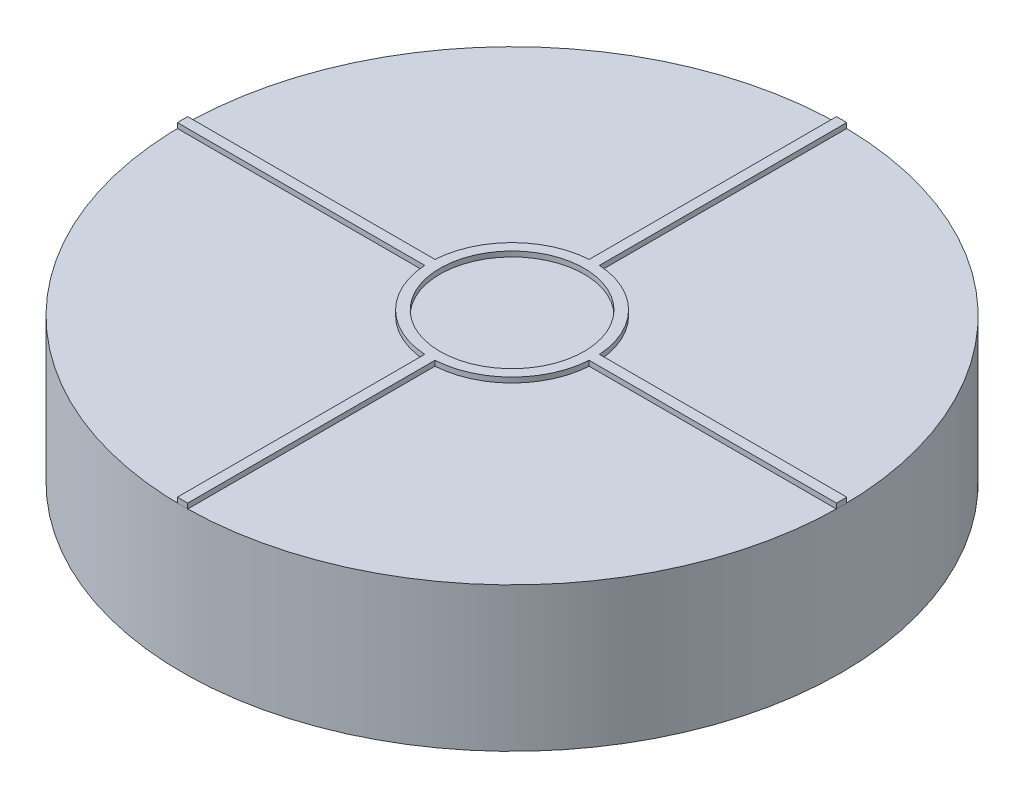
ISO-10303-21;
HEADER;
FILE_DESCRIPTION(('STEP AP214'),'2;1');
FILE_NAME('part.step','',(''),(''),'','','');
FILE_SCHEMA(('AUTOMOTIVE_DESIGN { 1 0 10303 214 1 1 1 1 }'));
ENDSEC;
DATA;
#1=APPLICATION_CONTEXT('core data for automotive mechanical design processes');
#2=APPLICATION_PROTOCOL_DEFINITION('international standard','automotive_design',2000,#1);
#3=PRODUCT_CONTEXT('',#1,'mechanical');
#4=PRODUCT('Part','Part','',(#3));
#5=PRODUCT_RELATED_PRODUCT_CATEGORY('part','',(#4));
#6=PRODUCT_DEFINITION_FORMATION('','',#4);
#7=PRODUCT_DEFINITION_CONTEXT('part definition',#1,'design');
#8=PRODUCT_DEFINITION('design','',#6,#7);
#9=PRODUCT_DEFINITION_SHAPE('','',#8);
#10=(LENGTH_UNIT() NAMED_UNIT(*) SI_UNIT(.MILLI.,.METRE.));
#11=(NAMED_UNIT(*) PLANE_ANGLE_UNIT() SI_UNIT($,.RADIAN.));
#12=(NAMED_UNIT(*) SI_UNIT($,.STERADIAN.) SOLID_ANGLE_UNIT());
#13=UNCERTAINTY_MEASURE_WITH_UNIT(LENGTH_MEASURE(1.E-05),#10,'distance_accuracy_value','');
#14=(GEOMETRIC_REPRESENTATION_CONTEXT(3) GLOBAL_UNCERTAINTY_ASSIGNED_CONTEXT((#13)) GLOBAL_UNIT_ASSIGNED_CONTEXT((#10,
#11,#12)) REPRESENTATION_CONTEXT('',''));
#15=CARTESIAN_POINT('',(0.,0.,0.));
#16=DIRECTION('',(0.,0.,1.));
#17=DIRECTION('',(1.,0.,0.));
#18=AXIS2_PLACEMENT_3D('',#15,#16,#17);
#19=CARTESIAN_POINT('',(0.,7.25,0.));
#20=DIRECTION('',(0.,-1.,0.));
#21=DIRECTION('',(1.,0.,0.));
#22=AXIS2_PLACEMENT_3D('',#19,#20,#21);
#23=CYLINDRICAL_SURFACE('',#22,4.);
#24=CARTESIAN_POINT('',(0.,7.,0.));
#25=DIRECTION('',(0.,1.,0.));
#26=DIRECTION('',(0.,0.,1.));
#27=AXIS2_PLACEMENT_3D('',#24,#25,#26);
#28=CIRCLE('',#27,4.);
#29=CARTESIAN_POINT('',(0.25,7.,3.99217985566783));
#30=VERTEX_POINT('',#29);
#31=CARTESIAN_POINT('',(3.99217985566783,7.,0.25));
#32=VERTEX_POINT('',#31);
#33=EDGE_CURVE('E199',#30,#32,#28,.T.);
#34=ORIENTED_EDGE('',*,*,#33,.T.);
#35=DIRECTION('',(0.,-1.,0.));
#36=VECTOR('',#35,1.);
#37=CARTESIAN_POINT('',(3.99217985566783,7.25,0.25));
#38=LINE('',#37,#36);
#39=CARTESIAN_POINT('',(3.99217985566783,7.25,0.25));
#40=VERTEX_POINT('',#39);
#41=EDGE_CURVE('E12',#40,#32,#38,.T.);
#42=ORIENTED_EDGE('',*,*,#41,.F.);
#43=CARTESIAN_POINT('',(0.,7.25,0.));
#44=DIRECTION('',(0.,1.,0.));
#45=DIRECTION('',(0.,0.,1.));
#46=AXIS2_PLACEMENT_3D('',#43,#44,#45);
#47=CIRCLE('',#46,4.);
#48=CARTESIAN_POINT('',(0.25,7.25,3.99217985566783));
#49=VERTEX_POINT('',#48);
#50=EDGE_CURVE('E190',#49,#40,#47,.T.);
#51=ORIENTED_EDGE('',*,*,#50,.F.);
#52=DIRECTION('',(0.,-1.,0.));
#53=VECTOR('',#52,1.);
#54=CARTESIAN_POINT('',(0.25,7.25,3.99217985566783));
#55=LINE('',#54,#53);
#56=EDGE_CURVE('E195',#49,#30,#55,.T.);
#57=ORIENTED_EDGE('',*,*,#56,.T.);
#58=EDGE_LOOP('',(#34,#42,#51,#57));
#59=FACE_BOUND('',#58,.T.);
#60=ADVANCED_FACE('F47',(#59),#23,.T.);
#61=CARTESIAN_POINT('',(0.,7.25,0.25));
#62=DIRECTION('',(0.,0.,-1.));
#63=DIRECTION('',(-1.,0.,0.));
#64=AXIS2_PLACEMENT_3D('',#61,#62,#63);
#65=PLANE('',#64);
#66=DIRECTION('',(1.,0.,0.));
#67=VECTOR('',#66,1.);
#68=CARTESIAN_POINT('',(0.,7.,0.25));
#69=LINE('',#68,#67);
#70=CARTESIAN_POINT('',(15.9980467557762,7.,0.25));
#71=VERTEX_POINT('',#70);
#72=EDGE_CURVE('E202',#32,#71,#69,.T.);
#73=ORIENTED_EDGE('',*,*,#72,.T.);
#74=DIRECTION('',(0.,-1.,0.));
#75=VECTOR('',#74,1.);
#76=CARTESIAN_POINT('',(15.9980467557762,7.25,0.25));
#77=LINE('',#76,#75);
#78=CARTESIAN_POINT('',(15.9980467557762,7.25,0.25));
#79=VERTEX_POINT('',#78);
#80=EDGE_CURVE('E56',#79,#71,#77,.T.);
#81=ORIENTED_EDGE('',*,*,#80,.F.);
#82=DIRECTION('',(1.,0.,0.));
#83=VECTOR('',#82,1.);
#84=CARTESIAN_POINT('',(0.,7.25,0.25));
#85=LINE('',#84,#83);
#86=EDGE_CURVE('E130',#40,#79,#85,.T.);
#87=ORIENTED_EDGE('',*,*,#86,.F.);
#88=ORIENTED_EDGE('',*,*,#41,.T.);
#89=EDGE_LOOP('',(#73,#81,#87,#88));
#90=FACE_BOUND('',#89,.T.);
#91=ADVANCED_FACE('F320',(#90),#65,.F.);
#92=CARTESIAN_POINT('',(0.,7.25,0.));
#93=DIRECTION('',(0.,-1.,0.));
#94=DIRECTION('',(1.,0.,0.));
#95=AXIS2_PLACEMENT_3D('',#92,#93,#94);
#96=CYLINDRICAL_SURFACE('',#95,16.);
#97=CARTESIAN_POINT('',(0.,7.,0.));
#98=DIRECTION('',(0.,1.,0.));
#99=DIRECTION('',(0.,0.,1.));
#100=AXIS2_PLACEMENT_3D('',#97,#98,#99);
#101=CIRCLE('',#100,16.);
#102=CARTESIAN_POINT('',(15.9980467557762,7.,-0.25));
#103=VERTEX_POINT('',#102);
#104=EDGE_CURVE('E206',#71,#103,#101,.T.);
#105=ORIENTED_EDGE('',*,*,#104,.T.);
#106=DIRECTION('',(0.,-1.,0.));
#107=VECTOR('',#106,1.);
#108=CARTESIAN_POINT('',(15.9980467557762,7.25,-0.25));
#109=LINE('',#108,#107);
#110=CARTESIAN_POINT('',(15.9980467557762,7.25,-0.25));
#111=VERTEX_POINT('',#110);
#112=EDGE_CURVE('E257',#111,#103,#109,.T.);
#113=ORIENTED_EDGE('',*,*,#112,.F.);
#114=CARTESIAN_POINT('',(0.,7.25,0.));
#115=DIRECTION('',(0.,1.,0.));
#116=DIRECTION('',(0.,0.,1.));
#117=AXIS2_PLACEMENT_3D('',#114,#115,#116);
#118=CIRCLE('',#117,16.);
#119=EDGE_CURVE('E264',#79,#111,#118,.T.);
#120=ORIENTED_EDGE('',*,*,#119,.F.);
#121=ORIENTED_EDGE('',*,*,#80,.T.);
#122=EDGE_LOOP('',(#105,#113,#120,#121));
#123=FACE_BOUND('',#122,.T.);
#124=ADVANCED_FACE('F262',(#123),#96,.T.);
#125=CARTESIAN_POINT('',(0.,7.25,-0.25));
#126=DIRECTION('',(0.,0.,-1.));
#127=DIRECTION('',(-1.,0.,0.));
#128=AXIS2_PLACEMENT_3D('',#125,#126,#127);
#129=PLANE('',#128);
#130=DIRECTION('',(1.,0.,0.));
#131=VECTOR('',#130,1.);
#132=CARTESIAN_POINT('',(0.,7.,-0.25));
#133=LINE('',#132,#131);
#134=CARTESIAN_POINT('',(3.99217985566783,7.,-0.25));
#135=VERTEX_POINT('',#134);
#136=EDGE_CURVE('E209',#135,#103,#133,.T.);
#137=ORIENTED_EDGE('',*,*,#136,.F.);
#138=DIRECTION('',(0.,-1.,0.));
#139=VECTOR('',#138,1.);
#140=CARTESIAN_POINT('',(3.99217985566783,7.25,-0.25));
#141=LINE('',#140,#139);
#142=CARTESIAN_POINT('',(3.99217985566783,7.25,-0.25));
#143=VERTEX_POINT('',#142);
#144=EDGE_CURVE('E255',#143,#135,#141,.T.);
#145=ORIENTED_EDGE('',*,*,#144,.F.);
#146=DIRECTION('',(1.,0.,0.));
#147=VECTOR('',#146,1.);
#148=CARTESIAN_POINT('',(0.,7.25,-0.25));
#149=LINE('',#148,#147);
#150=EDGE_CURVE('E276',#143,#111,#149,.T.);
#151=ORIENTED_EDGE('',*,*,#150,.T.);
#152=ORIENTED_EDGE('',*,*,#112,.T.);
#153=EDGE_LOOP('',(#137,#145,#151,#152));
#154=FACE_BOUND('',#153,.T.);
#155=ADVANCED_FACE('F272',(#154),#129,.T.);
#156=CARTESIAN_POINT('',(0.25,7.,-3.99217985566783));
#157=VERTEX_POINT('',#156);
#158=EDGE_CURVE('E204',#135,#157,#28,.T.);
#159=ORIENTED_EDGE('',*,*,#158,.T.);
#160=DIRECTION('',(0.,-1.,0.));
#161=VECTOR('',#160,1.);
#162=CARTESIAN_POINT('',(0.25,7.25,-3.99217985566783));
#163=LINE('',#162,#161);
#164=CARTESIAN_POINT('',(0.25,7.25,-3.99217985566783));
#165=VERTEX_POINT('',#164);
#166=EDGE_CURVE('E252',#165,#157,#163,.T.);
#167=ORIENTED_EDGE('',*,*,#166,.F.);
#168=EDGE_CURVE('E277',#143,#165,#47,.T.);
#169=ORIENTED_EDGE('',*,*,#168,.F.);
#170=ORIENTED_EDGE('',*,*,#144,.T.);
#171=EDGE_LOOP('',(#159,#167,#169,#170));
#172=FACE_BOUND('',#171,.T.);
#173=ADVANCED_FACE('F322',(#172),#23,.T.);
#174=CARTESIAN_POINT('',(0.25,7.25,0.));
#175=DIRECTION('',(-1.,0.,0.));
#176=DIRECTION('',(0.,-1.,0.));
#177=AXIS2_PLACEMENT_3D('',#174,#175,#176);
#178=PLANE('',#177);
#179=DIRECTION('',(0.,0.,-1.));
#180=VECTOR('',#179,1.);
#181=CARTESIAN_POINT('',(0.25,7.,0.));
#182=LINE('',#181,#180);
#183=CARTESIAN_POINT('',(0.25,7.,-15.9980467557762));
#184=VERTEX_POINT('',#183);
#185=EDGE_CURVE('E212',#157,#184,#182,.T.);
#186=ORIENTED_EDGE('',*,*,#185,.T.);
#187=DIRECTION('',(0.,-1.,0.));
#188=VECTOR('',#187,1.);
#189=CARTESIAN_POINT('',(0.25,7.25,-15.9980467557762));
#190=LINE('',#189,#188);
#191=CARTESIAN_POINT('',(0.25,7.25,-15.9980467557762));
#192=VERTEX_POINT('',#191);
#193=EDGE_CURVE('E249',#192,#184,#190,.T.);
#194=ORIENTED_EDGE('',*,*,#193,.F.);
#195=DIRECTION('',(0.,0.,-1.));
#196=VECTOR('',#195,1.);
#197=CARTESIAN_POINT('',(0.25,7.25,0.));
#198=LINE('',#197,#196);
#199=EDGE_CURVE('E279',#165,#192,#198,.T.);
#200=ORIENTED_EDGE('',*,*,#199,.F.);
#201=ORIENTED_EDGE('',*,*,#166,.T.);
#202=EDGE_LOOP('',(#186,#194,#200,#201));
#203=FACE_BOUND('',#202,.T.);
#204=ADVANCED_FACE('F329',(#203),#178,.F.);
#205=CARTESIAN_POINT('',(0.,7.25,0.));
#206=DIRECTION('',(0.,-1.,0.));
#207=DIRECTION('',(1.,0.,0.));
#208=AXIS2_PLACEMENT_3D('',#205,#206,#207);
#209=CYLINDRICAL_SURFACE('',#208,16.);
#210=CARTESIAN_POINT('',(0.,7.,0.));
#211=DIRECTION('',(0.,1.,0.));
#212=DIRECTION('',(0.,0.,1.));
#213=AXIS2_PLACEMENT_3D('',#210,#211,#212);
#214=CIRCLE('',#213,16.);
#215=CARTESIAN_POINT('',(-0.25,7.,-15.9980467557762));
#216=VERTEX_POINT('',#215);
#217=EDGE_CURVE('E214',#184,#216,#214,.T.);
#218=ORIENTED_EDGE('',*,*,#217,.T.);
#219=DIRECTION('',(0.,-1.,0.));
#220=VECTOR('',#219,1.);
#221=CARTESIAN_POINT('',(-0.25,7.25,-15.9980467557762));
#222=LINE('',#221,#220);
#223=CARTESIAN_POINT('',(-0.25,7.25,-15.9980467557762));
#224=VERTEX_POINT('',#223);
#225=EDGE_CURVE('E247',#224,#216,#222,.T.);
#226=ORIENTED_EDGE('',*,*,#225,.F.);
#227=CARTESIAN_POINT('',(0.,7.25,0.));
#228=DIRECTION('',(0.,1.,0.));
#229=DIRECTION('',(0.,0.,1.));
#230=AXIS2_PLACEMENT_3D('',#227,#228,#229);
#231=CIRCLE('',#230,16.);
#232=EDGE_CURVE('E284',#192,#224,#231,.T.);
#233=ORIENTED_EDGE('',*,*,#232,.F.);
#234=ORIENTED_EDGE('',*,*,#193,.T.);
#235=EDGE_LOOP('',(#218,#226,#233,#234));
#236=FACE_BOUND('',#235,.T.);
#237=ADVANCED_FACE('F348',(#236),#209,.T.);
#238=CARTESIAN_POINT('',(-0.25,7.25,0.));
#239=DIRECTION('',(-1.,0.,0.));
#240=DIRECTION('',(0.,-1.,0.));
#241=AXIS2_PLACEMENT_3D('',#238,#239,#240);
#242=PLANE('',#241);
#243=DIRECTION('',(0.,0.,-1.));
#244=VECTOR('',#243,1.);
#245=CARTESIAN_POINT('',(-0.25,7.,0.));
#246=LINE('',#245,#244);
#247=CARTESIAN_POINT('',(-0.25,7.,-3.99217985566783));
#248=VERTEX_POINT('',#247);
#249=EDGE_CURVE('E217',#248,#216,#246,.T.);
#250=ORIENTED_EDGE('',*,*,#249,.F.);
#251=DIRECTION('',(0.,-1.,0.));
#252=VECTOR('',#251,1.);
#253=CARTESIAN_POINT('',(-0.25,7.25,-3.99217985566783));
#254=LINE('',#253,#252);
#255=CARTESIAN_POINT('',(-0.25,7.25,-3.99217985566783));
#256=VERTEX_POINT('',#255);
#257=EDGE_CURVE('E245',#256,#248,#254,.T.);
#258=ORIENTED_EDGE('',*,*,#257,.F.);
#259=DIRECTION('',(0.,0.,-1.));
#260=VECTOR('',#259,1.);
#261=CARTESIAN_POINT('',(-0.25,7.25,0.));
#262=LINE('',#261,#260);
#263=EDGE_CURVE('E286',#256,#224,#262,.T.);
#264=ORIENTED_EDGE('',*,*,#263,.T.);
#265=ORIENTED_EDGE('',*,*,#225,.T.);
#266=EDGE_LOOP('',(#250,#258,#264,#265));
#267=FACE_BOUND('',#266,.T.);
#268=ADVANCED_FACE('F340',(#267),#242,.T.);
#269=CARTESIAN_POINT('',(-3.99217985566783,7.,-0.25));
#270=VERTEX_POINT('',#269);
#271=EDGE_CURVE('E220',#248,#270,#28,.T.);
#272=ORIENTED_EDGE('',*,*,#271,.T.);
#273=DIRECTION('',(0.,-1.,0.));
#274=VECTOR('',#273,1.);
#275=CARTESIAN_POINT('',(-3.99217985566783,7.25,-0.25));
#276=LINE('',#275,#274);
#277=CARTESIAN_POINT('',(-3.99217985566783,7.25,-0.25));
#278=VERTEX_POINT('',#277);
#279=EDGE_CURVE('E243',#278,#270,#276,.T.);
#280=ORIENTED_EDGE('',*,*,#279,.F.);
#281=EDGE_CURVE('E189',#256,#278,#47,.T.);
#282=ORIENTED_EDGE('',*,*,#281,.F.);
#283=ORIENTED_EDGE('',*,*,#257,.T.);
#284=EDGE_LOOP('',(#272,#280,#282,#283));
#285=FACE_BOUND('',#284,.T.);
#286=ADVANCED_FACE('F331',(#285),#23,.T.);
#287=CARTESIAN_POINT('',(0.,7.25,-0.25));
#288=DIRECTION('',(0.,0.,-1.));
#289=DIRECTION('',(-1.,0.,0.));
#290=AXIS2_PLACEMENT_3D('',#287,#288,#289);
#291=PLANE('',#290);
#292=DIRECTION('',(1.,0.,0.));
#293=VECTOR('',#292,1.);
#294=CARTESIAN_POINT('',(0.,7.,-0.25));
#295=LINE('',#294,#293);
#296=CARTESIAN_POINT('',(-15.9980467557762,7.,-0.25));
#297=VERTEX_POINT('',#296);
#298=EDGE_CURVE('E221',#297,#270,#295,.T.);
#299=ORIENTED_EDGE('',*,*,#298,.F.);
#300=DIRECTION('',(0.,-1.,0.));
#301=VECTOR('',#300,1.);
#302=CARTESIAN_POINT('',(-15.9980467557762,7.25,-0.25));
#303=LINE('',#302,#301);
#304=CARTESIAN_POINT('',(-15.9980467557762,7.25,-0.25));
#305=VERTEX_POINT('',#304);
#306=EDGE_CURVE('E241',#305,#297,#303,.T.);
#307=ORIENTED_EDGE('',*,*,#306,.F.);
#308=DIRECTION('',(1.,0.,0.));
#309=VECTOR('',#308,1.);
#310=CARTESIAN_POINT('',(0.,7.25,-0.25));
#311=LINE('',#310,#309);
#312=EDGE_CURVE('E289',#305,#278,#311,.T.);
#313=ORIENTED_EDGE('',*,*,#312,.T.);
#314=ORIENTED_EDGE('',*,*,#279,.T.);
#315=EDGE_LOOP('',(#299,#307,#313,#314));
#316=FACE_BOUND('',#315,.T.);
#317=ADVANCED_FACE('F339',(#316),#291,.T.);
#318=CARTESIAN_POINT('',(0.,7.25,0.));
#319=DIRECTION('',(0.,-1.,0.));
#320=DIRECTION('',(1.,0.,0.));
#321=AXIS2_PLACEMENT_3D('',#318,#319,#320);
#322=CYLINDRICAL_SURFACE('',#321,16.);
#323=CARTESIAN_POINT('',(0.,7.,0.));
#324=DIRECTION('',(0.,1.,0.));
#325=DIRECTION('',(0.,0.,1.));
#326=AXIS2_PLACEMENT_3D('',#323,#324,#325);
#327=CIRCLE('',#326,16.);
#328=CARTESIAN_POINT('',(-15.9980467557762,7.,0.25));
#329=VERTEX_POINT('',#328);
#330=EDGE_CURVE('E224',#297,#329,#327,.T.);
#331=ORIENTED_EDGE('',*,*,#330,.T.);
#332=DIRECTION('',(0.,-1.,0.));
#333=VECTOR('',#332,1.);
#334=CARTESIAN_POINT('',(-15.9980467557762,7.25,0.25));
#335=LINE('',#334,#333);
#336=CARTESIAN_POINT('',(-15.9980467557762,7.25,0.25));
#337=VERTEX_POINT('',#336);
#338=EDGE_CURVE('E238',#337,#329,#335,.T.);
#339=ORIENTED_EDGE('',*,*,#338,.F.);
#340=CARTESIAN_POINT('',(0.,7.25,0.));
#341=DIRECTION('',(0.,1.,0.));
#342=DIRECTION('',(0.,0.,1.));
#343=AXIS2_PLACEMENT_3D('',#340,#341,#342);
#344=CIRCLE('',#343,16.);
#345=EDGE_CURVE('E291',#305,#337,#344,.T.);
#346=ORIENTED_EDGE('',*,*,#345,.F.);
#347=ORIENTED_EDGE('',*,*,#306,.T.);
#348=EDGE_LOOP('',(#331,#339,#346,#347));
#349=FACE_BOUND('',#348,.T.);
#350=ADVANCED_FACE('F337',(#349),#322,.T.);
#351=CARTESIAN_POINT('',(0.,7.25,0.25));
#352=DIRECTION('',(0.,0.,-1.));
#353=DIRECTION('',(-1.,0.,0.));
#354=AXIS2_PLACEMENT_3D('',#351,#352,#353);
#355=PLANE('',#354);
#356=DIRECTION('',(1.,0.,0.));
#357=VECTOR('',#356,1.);
#358=CARTESIAN_POINT('',(0.,7.,0.25));
#359=LINE('',#358,#357);
#360=CARTESIAN_POINT('',(-3.99217985566783,7.,0.25));
#361=VERTEX_POINT('',#360);
#362=EDGE_CURVE('E226',#329,#361,#359,.T.);
#363=ORIENTED_EDGE('',*,*,#362,.T.);
#364=DIRECTION('',(0.,-1.,0.));
#365=VECTOR('',#364,1.);
#366=CARTESIAN_POINT('',(-3.99217985566783,7.25,0.25));
#367=LINE('',#366,#365);
#368=CARTESIAN_POINT('',(-3.99217985566783,7.25,0.25));
#369=VERTEX_POINT('',#368);
#370=EDGE_CURVE('E235',#369,#361,#367,.T.);
#371=ORIENTED_EDGE('',*,*,#370,.F.);
#372=DIRECTION('',(1.,0.,0.));
#373=VECTOR('',#372,1.);
#374=CARTESIAN_POINT('',(0.,7.25,0.25));
#375=LINE('',#374,#373);
#376=EDGE_CURVE('E187',#337,#369,#375,.T.);
#377=ORIENTED_EDGE('',*,*,#376,.F.);
#378=ORIENTED_EDGE('',*,*,#338,.T.);
#379=EDGE_LOOP('',(#363,#371,#377,#378));
#380=FACE_BOUND('',#379,.T.);
#381=ADVANCED_FACE('F298',(#380),#355,.F.);
#382=CARTESIAN_POINT('',(-0.25,7.,3.99217985566783));
#383=VERTEX_POINT('',#382);
#384=EDGE_CURVE('E203',#361,#383,#28,.T.);
#385=ORIENTED_EDGE('',*,*,#384,.T.);
#386=DIRECTION('',(0.,-1.,0.));
#387=VECTOR('',#386,1.);
#388=CARTESIAN_POINT('',(-0.25,7.25,3.99217985566783));
#389=LINE('',#388,#387);
#390=CARTESIAN_POINT('',(-0.25,7.25,3.99217985566783));
#391=VERTEX_POINT('',#390);
#392=EDGE_CURVE('E176',#391,#383,#389,.T.);
#393=ORIENTED_EDGE('',*,*,#392,.F.);
#394=EDGE_CURVE('E184',#369,#391,#47,.T.);
#395=ORIENTED_EDGE('',*,*,#394,.F.);
#396=ORIENTED_EDGE('',*,*,#370,.T.);
#397=EDGE_LOOP('',(#385,#393,#395,#396));
#398=FACE_BOUND('',#397,.T.);
#399=ADVANCED_FACE('F303',(#398),#23,.T.);
#400=CARTESIAN_POINT('',(-0.25,7.25,0.));
#401=DIRECTION('',(-1.,0.,0.));
#402=DIRECTION('',(0.,-1.,0.));
#403=AXIS2_PLACEMENT_3D('',#400,#401,#402);
#404=PLANE('',#403);
#405=DIRECTION('',(0.,0.,-1.));
#406=VECTOR('',#405,1.);
#407=CARTESIAN_POINT('',(-0.25,7.,0.));
#408=LINE('',#407,#406);
#409=CARTESIAN_POINT('',(-0.25,7.,15.9980467557762));
#410=VERTEX_POINT('',#409);
#411=EDGE_CURVE('E175',#410,#383,#408,.T.);
#412=ORIENTED_EDGE('',*,*,#411,.F.);
#413=DIRECTION('',(0.,-1.,0.));
#414=VECTOR('',#413,1.);
#415=CARTESIAN_POINT('',(-0.25,7.25,15.9980467557762));
#416=LINE('',#415,#414);
#417=CARTESIAN_POINT('',(-0.25,7.25,15.9980467557762));
#418=VERTEX_POINT('',#417);
#419=EDGE_CURVE('E169',#418,#410,#416,.T.);
#420=ORIENTED_EDGE('',*,*,#419,.F.);
#421=DIRECTION('',(0.,0.,-1.));
#422=VECTOR('',#421,1.);
#423=CARTESIAN_POINT('',(-0.25,7.25,0.));
#424=LINE('',#423,#422);
#425=EDGE_CURVE('E173',#418,#391,#424,.T.);
#426=ORIENTED_EDGE('',*,*,#425,.T.);
#427=ORIENTED_EDGE('',*,*,#392,.T.);
#428=EDGE_LOOP('',(#412,#420,#426,#427));
#429=FACE_BOUND('',#428,.T.);
#430=ADVANCED_FACE('F171',(#429),#404,.T.);
#431=CARTESIAN_POINT('',(0.,7.25,0.));
#432=DIRECTION('',(0.,-1.,0.));
#433=DIRECTION('',(1.,0.,0.));
#434=AXIS2_PLACEMENT_3D('',#431,#432,#433);
#435=CYLINDRICAL_SURFACE('',#434,16.);
#436=CARTESIAN_POINT('',(0.,7.,0.));
#437=DIRECTION('',(0.,1.,0.));
#438=DIRECTION('',(0.,0.,1.));
#439=AXIS2_PLACEMENT_3D('',#436,#437,#438);
#440=CIRCLE('',#439,16.);
#441=CARTESIAN_POINT('',(0.25,7.,15.9980467557762));
#442=VERTEX_POINT('',#441);
#443=EDGE_CURVE('E116',#410,#442,#440,.T.);
#444=ORIENTED_EDGE('',*,*,#443,.T.);
#445=DIRECTION('',(0.,-1.,0.));
#446=VECTOR('',#445,1.);
#447=CARTESIAN_POINT('',(0.25,7.25,15.9980467557762));
#448=LINE('',#447,#446);
#449=CARTESIAN_POINT('',(0.25,7.25,15.9980467557762));
#450=VERTEX_POINT('',#449);
#451=EDGE_CURVE('E177',#450,#442,#448,.T.);
#452=ORIENTED_EDGE('',*,*,#451,.F.);
#453=CARTESIAN_POINT('',(0.,7.25,0.));
#454=DIRECTION('',(0.,1.,0.));
#455=DIRECTION('',(0.,0.,1.));
#456=AXIS2_PLACEMENT_3D('',#453,#454,#455);
#457=CIRCLE('',#456,16.);
#458=EDGE_CURVE('E179',#418,#450,#457,.T.);
#459=ORIENTED_EDGE('',*,*,#458,.F.);
#460=ORIENTED_EDGE('',*,*,#419,.T.);
#461=EDGE_LOOP('',(#444,#452,#459,#460));
#462=FACE_BOUND('',#461,.T.);
#463=ADVANCED_FACE('F180',(#462),#435,.T.);
#464=CARTESIAN_POINT('',(0.,7.25,0.));
#465=DIRECTION('',(0.,-1.,0.));
#466=DIRECTION('',(1.,0.,0.));
#467=AXIS2_PLACEMENT_3D('',#464,#465,#466);
#468=CYLINDRICAL_SURFACE('',#467,3.5);
#469=CARTESIAN_POINT('',(0.,7.25,0.));
#470=DIRECTION('',(0.,1.,0.));
#471=DIRECTION('',(0.,0.,1.));
#472=AXIS2_PLACEMENT_3D('',#469,#470,#471);
#473=CIRCLE('',#472,3.5);
#474=CARTESIAN_POINT('',(0.,7.25,3.5));
#475=VERTEX_POINT('',#474);
#476=EDGE_CURVE('E231',#475,#475,#473,.T.);
#477=ORIENTED_EDGE('',*,*,#476,.T.);
#478=EDGE_LOOP('',(#477));
#479=FACE_BOUND('',#478,.T.);
#480=CARTESIAN_POINT('',(0.,7.,0.));
#481=DIRECTION('',(0.,1.,0.));
#482=DIRECTION('',(0.,0.,1.));
#483=AXIS2_PLACEMENT_3D('',#480,#481,#482);
#484=CIRCLE('',#483,3.5);
#485=CARTESIAN_POINT('',(0.,7.,3.5));
#486=VERTEX_POINT('',#485);
#487=EDGE_CURVE('E196',#486,#486,#484,.T.);
#488=ORIENTED_EDGE('',*,*,#487,.F.);
#489=EDGE_LOOP('',(#488));
#490=FACE_BOUND('',#489,.T.);
#491=ADVANCED_FACE('F49',(#479,#490),#468,.F.);
#492=CARTESIAN_POINT('',(0.25,7.25,0.));
#493=DIRECTION('',(-1.,0.,0.));
#494=DIRECTION('',(0.,-1.,0.));
#495=AXIS2_PLACEMENT_3D('',#492,#493,#494);
#496=PLANE('',#495);
#497=DIRECTION('',(0.,0.,-1.));
#498=VECTOR('',#497,1.);
#499=CARTESIAN_POINT('',(0.25,7.,0.));
#500=LINE('',#499,#498);
#501=EDGE_CURVE('E122',#442,#30,#500,.T.);
#502=ORIENTED_EDGE('',*,*,#501,.T.);
#503=ORIENTED_EDGE('',*,*,#56,.F.);
#504=DIRECTION('',(0.,0.,-1.));
#505=VECTOR('',#504,1.);
#506=CARTESIAN_POINT('',(0.25,7.25,0.));
#507=LINE('',#506,#505);
#508=EDGE_CURVE('E64',#450,#49,#507,.T.);
#509=ORIENTED_EDGE('',*,*,#508,.F.);
#510=ORIENTED_EDGE('',*,*,#451,.T.);
#511=EDGE_LOOP('',(#502,#503,#509,#510));
#512=FACE_BOUND('',#511,.T.);
#513=ADVANCED_FACE('F307',(#512),#496,.F.);
#514=CARTESIAN_POINT('',(0.,7.25,0.));
#515=DIRECTION('',(0.,1.,0.));
#516=DIRECTION('',(0.,0.,1.));
#517=AXIS2_PLACEMENT_3D('',#514,#515,#516);
#518=PLANE('',#517);
#519=ORIENTED_EDGE('',*,*,#476,.F.);
#520=EDGE_LOOP('',(#519));
#521=FACE_BOUND('',#520,.T.);
#522=ORIENTED_EDGE('',*,*,#50,.T.);
#523=ORIENTED_EDGE('',*,*,#86,.T.);
#524=ORIENTED_EDGE('',*,*,#119,.T.);
#525=ORIENTED_EDGE('',*,*,#150,.F.);
#526=ORIENTED_EDGE('',*,*,#168,.T.);
#527=ORIENTED_EDGE('',*,*,#199,.T.);
#528=ORIENTED_EDGE('',*,*,#232,.T.);
#529=ORIENTED_EDGE('',*,*,#263,.F.);
#530=ORIENTED_EDGE('',*,*,#281,.T.);
#531=ORIENTED_EDGE('',*,*,#312,.F.);
#532=ORIENTED_EDGE('',*,*,#345,.T.);
#533=ORIENTED_EDGE('',*,*,#376,.T.);
#534=ORIENTED_EDGE('',*,*,#394,.T.);
#535=ORIENTED_EDGE('',*,*,#425,.F.);
#536=ORIENTED_EDGE('',*,*,#458,.T.);
#537=ORIENTED_EDGE('',*,*,#508,.T.);
#538=EDGE_LOOP('',(#522,#523,#524,#525,#526,#527,#528,#529,#530,#531,#532,#533,#534,#535,#536,#537));
#539=FACE_BOUND('',#538,.T.);
#540=ADVANCED_FACE('F182',(#521,#539),#518,.T.);
#541=CARTESIAN_POINT('',(0.,7.,0.));
#542=DIRECTION('',(0.,1.,0.));
#543=DIRECTION('',(0.,0.,1.));
#544=AXIS2_PLACEMENT_3D('',#541,#542,#543);
#545=PLANE('',#544);
#546=ORIENTED_EDGE('',*,*,#487,.T.);
#547=EDGE_LOOP('',(#546));
#548=FACE_BOUND('',#547,.T.);
#549=ORIENTED_EDGE('',*,*,#33,.F.);
#550=ORIENTED_EDGE('',*,*,#501,.F.);
#551=ORIENTED_EDGE('',*,*,#443,.F.);
#552=ORIENTED_EDGE('',*,*,#411,.T.);
#553=ORIENTED_EDGE('',*,*,#384,.F.);
#554=ORIENTED_EDGE('',*,*,#362,.F.);
#555=ORIENTED_EDGE('',*,*,#330,.F.);
#556=ORIENTED_EDGE('',*,*,#298,.T.);
#557=ORIENTED_EDGE('',*,*,#271,.F.);
#558=ORIENTED_EDGE('',*,*,#249,.T.);
#559=ORIENTED_EDGE('',*,*,#217,.F.);
#560=ORIENTED_EDGE('',*,*,#185,.F.);
#561=ORIENTED_EDGE('',*,*,#158,.F.);
#562=ORIENTED_EDGE('',*,*,#136,.T.);
#563=ORIENTED_EDGE('',*,*,#104,.F.);
#564=ORIENTED_EDGE('',*,*,#72,.F.);
#565=EDGE_LOOP('',(#549,#550,#551,#552,#553,#554,#555,#556,#557,#558,#559,#560,#561,#562,#563,#564));
#566=FACE_BOUND('',#565,.T.);
#567=ADVANCED_FACE('F267',(#548,#566),#545,.F.);
#568=CLOSED_SHELL('',(#60,#91,#124,#155,#173,#204,#237,#268,#286,#317,#350,#381,#399,#430,#463,
#491,#513,#540,#567));
#569=MANIFOLD_SOLID_BREP('B2',#568);
#570=CARTESIAN_POINT('',(0.,5.,0.));
#571=DIRECTION('',(0.,-1.,0.));
#572=DIRECTION('',(1.,0.,0.));
#573=AXIS2_PLACEMENT_3D('',#570,#571,#572);
#574=CYLINDRICAL_SURFACE('',#573,15.);
#575=CARTESIAN_POINT('',(0.,5.,0.));
#576=DIRECTION('',(0.,1.,0.));
#577=DIRECTION('',(-1.,0.,0.));
#578=AXIS2_PLACEMENT_3D('',#575,#576,#577);
#579=CIRCLE('',#578,15.);
#580=CARTESIAN_POINT('',(-15.,5.,0.));
#581=VERTEX_POINT('',#580);
#582=EDGE_CURVE('E46',#581,#581,#579,.T.);
#583=ORIENTED_EDGE('',*,*,#582,.F.);
#584=EDGE_LOOP('',(#583));
#585=FACE_BOUND('',#584,.T.);
#586=CARTESIAN_POINT('',(0.,0.999999999999999,0.));
#587=DIRECTION('',(0.,1.,0.));
#588=DIRECTION('',(-1.,0.,0.));
#589=AXIS2_PLACEMENT_3D('',#586,#587,#588);
#590=CIRCLE('',#589,15.);
#591=CARTESIAN_POINT('',(-15.,0.999999999999998,0.));
#592=VERTEX_POINT('',#591);
#593=EDGE_CURVE('E532',#592,#592,#590,.T.);
#594=ORIENTED_EDGE('',*,*,#593,.T.);
#595=EDGE_LOOP('',(#594));
#596=FACE_BOUND('',#595,.T.);
#597=ADVANCED_FACE('F525',(#585,#596),#574,.T.);
#598=CARTESIAN_POINT('',(0.,5.,0.));
#599=DIRECTION('',(0.,1.,0.));
#600=DIRECTION('',(-1.,0.,0.));
#601=AXIS2_PLACEMENT_3D('',#598,#599,#600);
#602=PLANE('',#601);
#603=CARTESIAN_POINT('',(0.,5.,0.));
#604=DIRECTION('',(0.,1.,0.));
#605=DIRECTION('',(-1.,0.,0.));
#606=AXIS2_PLACEMENT_3D('',#603,#604,#605);
#607=CIRCLE('',#606,2.95803989154981);
#608=CARTESIAN_POINT('',(-2.95803989154981,5.,0.));
#609=VERTEX_POINT('',#608);
#610=EDGE_CURVE('E528',#609,#609,#607,.T.);
#611=ORIENTED_EDGE('',*,*,#610,.F.);
#612=EDGE_LOOP('',(#611));
#613=FACE_BOUND('',#612,.T.);
#614=ORIENTED_EDGE('',*,*,#582,.T.);
#615=EDGE_LOOP('',(#614));
#616=FACE_BOUND('',#615,.T.);
#617=ADVANCED_FACE('F544',(#613,#616),#602,.T.);
#618=CARTESIAN_POINT('',(0.,0.999999999999999,0.));
#619=DIRECTION('',(0.,1.,0.));
#620=DIRECTION('',(-1.,0.,0.));
#621=AXIS2_PLACEMENT_3D('',#618,#619,#620);
#622=PLANE('',#621);
#623=ORIENTED_EDGE('',*,*,#593,.F.);
#624=EDGE_LOOP('',(#623));
#625=FACE_BOUND('',#624,.T.);
#626=ADVANCED_FACE('F546',(#625),#622,.F.);
#627=CARTESIAN_POINT('',(0.,4.5,0.));
#628=DIRECTION('',(0.,1.,0.));
#629=DIRECTION('',(0.,0.,1.));
#630=AXIS2_PLACEMENT_3D('',#627,#628,#629);
#631=SPHERICAL_SURFACE('',#630,3.);
#632=ORIENTED_EDGE('',*,*,#610,.T.);
#633=EDGE_LOOP('',(#632));
#634=FACE_BOUND('',#633,.T.);
#635=ADVANCED_FACE('F542',(#634),#631,.F.);
#636=CLOSED_SHELL('',(#597,#617,#626,#635));
#637=MANIFOLD_SOLID_BREP('B6',#636);
#638=CARTESIAN_POINT('',(0.,0.,0.));
#639=DIRECTION('',(0.,1.,0.));
#640=DIRECTION('',(-1.,0.,0.));
#641=AXIS2_PLACEMENT_3D('',#638,#639,#640);
#642=PLANE('',#641);
#643=CARTESIAN_POINT('',(0.,0.,0.));
#644=DIRECTION('',(0.,-1.,0.));
#645=DIRECTION('',(1.,0.,0.));
#646=AXIS2_PLACEMENT_3D('',#643,#644,#645);
#647=CIRCLE('',#646,16.);
#648=CARTESIAN_POINT('',(16.,0.,0.));
#649=VERTEX_POINT('',#648);
#650=EDGE_CURVE('E524',#649,#649,#647,.T.);
#651=ORIENTED_EDGE('',*,*,#650,.T.);
#652=EDGE_LOOP('',(#651));
#653=FACE_BOUND('',#652,.T.);
#654=ADVANCED_FACE('F581',(#653),#642,.F.);
#655=CARTESIAN_POINT('',(0.,0.,0.));
#656=DIRECTION('',(0.,-1.,0.));
#657=DIRECTION('',(1.,0.,0.));
#658=AXIS2_PLACEMENT_3D('',#655,#656,#657);
#659=CYLINDRICAL_SURFACE('',#658,16.);
#660=ORIENTED_EDGE('',*,*,#650,.F.);
#661=EDGE_LOOP('',(#660));
#662=FACE_BOUND('',#661,.T.);
#663=CARTESIAN_POINT('',(0.,7.,0.));
#664=DIRECTION('',(0.,-1.,0.));
#665=DIRECTION('',(1.,0.,0.));
#666=AXIS2_PLACEMENT_3D('',#663,#664,#665);
#667=CIRCLE('',#666,16.);
#668=CARTESIAN_POINT('',(16.,7.,0.));
#669=VERTEX_POINT('',#668);
#670=EDGE_CURVE('E588',#669,#669,#667,.T.);
#671=ORIENTED_EDGE('',*,*,#670,.T.);
#672=EDGE_LOOP('',(#671));
#673=FACE_BOUND('',#672,.T.);
#674=ADVANCED_FACE('F622',(#662,#673),#659,.T.);
#675=CARTESIAN_POINT('',(-16.,7.,0.));
#676=DIRECTION('',(0.,-1.,0.));
#677=DIRECTION('',(1.,0.,0.));
#678=AXIS2_PLACEMENT_3D('',#675,#676,#677);
#679=PLANE('',#678);
#680=ORIENTED_EDGE('',*,*,#670,.F.);
#681=EDGE_LOOP('',(#680));
#682=FACE_BOUND('',#681,.T.);
#683=ADVANCED_FACE('F621',(#682),#679,.F.);
#684=CLOSED_SHELL('',(#654,#674,#683));
#685=CARTESIAN_POINT('',(0.,6.,0.));
#686=DIRECTION('',(0.,1.,0.));
#687=DIRECTION('',(-1.,0.,0.));
#688=AXIS2_PLACEMENT_3D('',#685,#686,#687);
#689=PLANE('',#688);
#690=CARTESIAN_POINT('',(0.,6.,0.));
#691=DIRECTION('',(0.,-1.,0.));
#692=DIRECTION('',(1.,0.,0.));
#693=AXIS2_PLACEMENT_3D('',#690,#691,#692);
#694=CIRCLE('',#693,15.);
#695=CARTESIAN_POINT('',(15.,6.,0.));
#696=VERTEX_POINT('',#695);
#697=EDGE_CURVE('E592',#696,#696,#694,.T.);
#698=ORIENTED_EDGE('',*,*,#697,.T.);
#699=EDGE_LOOP('',(#698));
#700=FACE_BOUND('',#699,.T.);
#701=ADVANCED_FACE('F611',(#700),#689,.F.);
#702=CARTESIAN_POINT('',(0.,0.,0.));
#703=DIRECTION('',(0.,-1.,0.));
#704=DIRECTION('',(1.,0.,0.));
#705=AXIS2_PLACEMENT_3D('',#702,#703,#704);
#706=CYLINDRICAL_SURFACE('',#705,15.);
#707=ORIENTED_EDGE('',*,*,#697,.F.);
#708=EDGE_LOOP('',(#707));
#709=FACE_BOUND('',#708,.T.);
#710=CARTESIAN_POINT('',(0.,0.999999999999999,0.));
#711=DIRECTION('',(0.,-1.,0.));
#712=DIRECTION('',(1.,0.,0.));
#713=AXIS2_PLACEMENT_3D('',#710,#711,#712);
#714=CIRCLE('',#713,15.);
#715=CARTESIAN_POINT('',(15.,0.999999999999999,0.));
#716=VERTEX_POINT('',#715);
#717=EDGE_CURVE('E596',#716,#716,#714,.T.);
#718=ORIENTED_EDGE('',*,*,#717,.T.);
#719=EDGE_LOOP('',(#718));
#720=FACE_BOUND('',#719,.T.);
#721=ADVANCED_FACE('F602',(#709,#720),#706,.F.);
#722=CARTESIAN_POINT('',(-15.,0.999999999999998,0.));
#723=DIRECTION('',(0.,-1.,0.));
#724=DIRECTION('',(1.,0.,0.));
#725=AXIS2_PLACEMENT_3D('',#722,#723,#724);
#726=PLANE('',#725);
#727=ORIENTED_EDGE('',*,*,#717,.F.);
#728=EDGE_LOOP('',(#727));
#729=FACE_BOUND('',#728,.T.);
#730=ADVANCED_FACE('F604',(#729),#726,.F.);
#731=CLOSED_SHELL('',(#701,#721,#730));
#732=ORIENTED_CLOSED_SHELL('',*,#731,.T.);
#733=BREP_WITH_VOIDS('B41',#684,(#732));
#734=ADVANCED_BREP_SHAPE_REPRESENTATION('',(#18,#569,#637,#733),#14);
#735=SHAPE_DEFINITION_REPRESENTATION(#9,#734);
ENDSEC;
END-ISO-10303-21;
